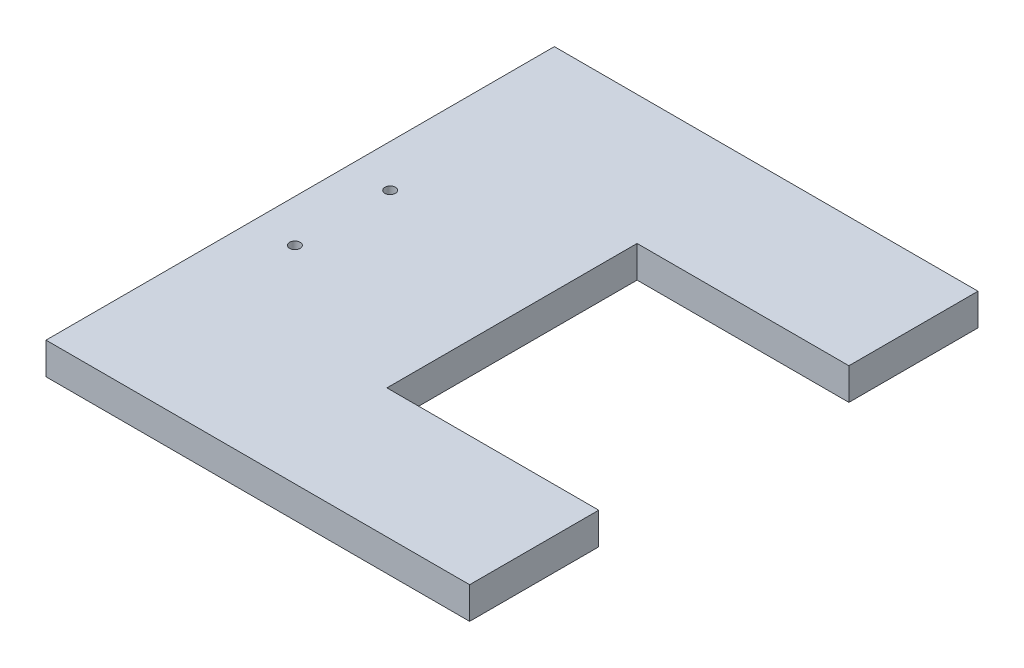
ISO-10303-21;
HEADER;
FILE_DESCRIPTION(('STEP AP214'),'2;1');
FILE_NAME('part.step','',(''),(''),'','','');
FILE_SCHEMA(('AUTOMOTIVE_DESIGN { 1 0 10303 214 1 1 1 1 }'));
ENDSEC;
DATA;
#1=APPLICATION_CONTEXT('core data for automotive mechanical design processes');
#2=APPLICATION_PROTOCOL_DEFINITION('international standard','automotive_design',2000,#1);
#3=PRODUCT_CONTEXT('',#1,'mechanical');
#4=PRODUCT('Part','Part','',(#3));
#5=PRODUCT_RELATED_PRODUCT_CATEGORY('part','',(#4));
#6=PRODUCT_DEFINITION_FORMATION('','',#4);
#7=PRODUCT_DEFINITION_CONTEXT('part definition',#1,'design');
#8=PRODUCT_DEFINITION('design','',#6,#7);
#9=PRODUCT_DEFINITION_SHAPE('','',#8);
#10=(LENGTH_UNIT() NAMED_UNIT(*) SI_UNIT(.MILLI.,.METRE.));
#11=(NAMED_UNIT(*) PLANE_ANGLE_UNIT() SI_UNIT($,.RADIAN.));
#12=(NAMED_UNIT(*) SI_UNIT($,.STERADIAN.) SOLID_ANGLE_UNIT());
#13=UNCERTAINTY_MEASURE_WITH_UNIT(LENGTH_MEASURE(1.E-05),#10,'distance_accuracy_value','');
#14=(GEOMETRIC_REPRESENTATION_CONTEXT(3) GLOBAL_UNCERTAINTY_ASSIGNED_CONTEXT((#13)) GLOBAL_UNIT_ASSIGNED_CONTEXT((#10,
#11,#12)) REPRESENTATION_CONTEXT('',''));
#15=CARTESIAN_POINT('',(0.,0.,0.));
#16=DIRECTION('',(0.,0.,1.));
#17=DIRECTION('',(1.,0.,0.));
#18=AXIS2_PLACEMENT_3D('',#15,#16,#17);
#19=CARTESIAN_POINT('',(0.,19.05,0.));
#20=DIRECTION('',(1.,0.,0.));
#21=DIRECTION('',(0.,0.,-1.));
#22=AXIS2_PLACEMENT_3D('',#19,#20,#21);
#23=PLANE('',#22);
#24=DIRECTION('',(0.,0.,1.));
#25=VECTOR('',#24,1.);
#26=CARTESIAN_POINT('',(0.,0.,0.));
#27=LINE('',#26,#25);
#28=CARTESIAN_POINT('',(0.,0.,-75.));
#29=VERTEX_POINT('',#28);
#30=CARTESIAN_POINT('',(0.,0.,75.));
#31=VERTEX_POINT('',#30);
#32=EDGE_CURVE('E156',#29,#31,#27,.T.);
#33=ORIENTED_EDGE('',*,*,#32,.F.);
#34=DIRECTION('',(0.,-1.,0.));
#35=VECTOR('',#34,1.);
#36=CARTESIAN_POINT('',(0.,19.05,-75.));
#37=LINE('',#36,#35);
#38=CARTESIAN_POINT('',(0.,19.05,-75.));
#39=VERTEX_POINT('',#38);
#40=EDGE_CURVE('E11',#39,#29,#37,.T.);
#41=ORIENTED_EDGE('',*,*,#40,.F.);
#42=DIRECTION('',(0.,0.,1.));
#43=VECTOR('',#42,1.);
#44=CARTESIAN_POINT('',(0.,19.05,0.));
#45=LINE('',#44,#43);
#46=CARTESIAN_POINT('',(0.,19.05,75.));
#47=VERTEX_POINT('',#46);
#48=EDGE_CURVE('E139',#39,#47,#45,.T.);
#49=ORIENTED_EDGE('',*,*,#48,.T.);
#50=DIRECTION('',(0.,-1.,0.));
#51=VECTOR('',#50,1.);
#52=CARTESIAN_POINT('',(0.,19.05,75.));
#53=LINE('',#52,#51);
#54=EDGE_CURVE('E87',#47,#31,#53,.T.);
#55=ORIENTED_EDGE('',*,*,#54,.T.);
#56=EDGE_LOOP('',(#33,#41,#49,#55));
#57=FACE_BOUND('',#56,.T.);
#58=ADVANCED_FACE('F37',(#57),#23,.T.);
#59=CARTESIAN_POINT('',(0.,19.05,-75.));
#60=DIRECTION('',(0.,0.,1.));
#61=DIRECTION('',(1.,0.,0.));
#62=AXIS2_PLACEMENT_3D('',#59,#60,#61);
#63=PLANE('',#62);
#64=DIRECTION('',(-1.,0.,0.));
#65=VECTOR('',#64,1.);
#66=CARTESIAN_POINT('',(0.,0.,-75.));
#67=LINE('',#66,#65);
#68=CARTESIAN_POINT('',(127.,0.,-75.));
#69=VERTEX_POINT('',#68);
#70=EDGE_CURVE('E160',#69,#29,#67,.T.);
#71=ORIENTED_EDGE('',*,*,#70,.F.);
#72=DIRECTION('',(0.,-1.,0.));
#73=VECTOR('',#72,1.);
#74=CARTESIAN_POINT('',(127.,19.05,-75.));
#75=LINE('',#74,#73);
#76=CARTESIAN_POINT('',(127.,19.05,-75.));
#77=VERTEX_POINT('',#76);
#78=EDGE_CURVE('E45',#77,#69,#75,.T.);
#79=ORIENTED_EDGE('',*,*,#78,.F.);
#80=DIRECTION('',(-1.,0.,0.));
#81=VECTOR('',#80,1.);
#82=CARTESIAN_POINT('',(0.,19.05,-75.));
#83=LINE('',#82,#81);
#84=EDGE_CURVE('E134',#77,#39,#83,.T.);
#85=ORIENTED_EDGE('',*,*,#84,.T.);
#86=ORIENTED_EDGE('',*,*,#40,.T.);
#87=EDGE_LOOP('',(#71,#79,#85,#86));
#88=FACE_BOUND('',#87,.T.);
#89=ADVANCED_FACE('F186',(#88),#63,.T.);
#90=CARTESIAN_POINT('',(127.,19.05,0.));
#91=DIRECTION('',(1.,0.,0.));
#92=DIRECTION('',(0.,0.,-1.));
#93=AXIS2_PLACEMENT_3D('',#90,#91,#92);
#94=PLANE('',#93);
#95=DIRECTION('',(0.,0.,1.));
#96=VECTOR('',#95,1.);
#97=CARTESIAN_POINT('',(127.,0.,0.));
#98=LINE('',#97,#96);
#99=CARTESIAN_POINT('',(127.,0.,-152.4));
#100=VERTEX_POINT('',#99);
#101=EDGE_CURVE('E164',#100,#69,#98,.T.);
#102=ORIENTED_EDGE('',*,*,#101,.F.);
#103=DIRECTION('',(0.,-1.,0.));
#104=VECTOR('',#103,1.);
#105=CARTESIAN_POINT('',(127.,19.05,-152.4));
#106=LINE('',#105,#104);
#107=CARTESIAN_POINT('',(127.,19.05,-152.4));
#108=VERTEX_POINT('',#107);
#109=EDGE_CURVE('E182',#108,#100,#106,.T.);
#110=ORIENTED_EDGE('',*,*,#109,.F.);
#111=DIRECTION('',(0.,0.,1.));
#112=VECTOR('',#111,1.);
#113=CARTESIAN_POINT('',(127.,19.05,0.));
#114=LINE('',#113,#112);
#115=EDGE_CURVE('E128',#108,#77,#114,.T.);
#116=ORIENTED_EDGE('',*,*,#115,.T.);
#117=ORIENTED_EDGE('',*,*,#78,.T.);
#118=EDGE_LOOP('',(#102,#110,#116,#117));
#119=FACE_BOUND('',#118,.T.);
#120=ADVANCED_FACE('F185',(#119),#94,.T.);
#121=CARTESIAN_POINT('',(0.,19.05,-152.4));
#122=DIRECTION('',(0.,0.,-1.));
#123=DIRECTION('',(-1.,0.,0.));
#124=AXIS2_PLACEMENT_3D('',#121,#122,#123);
#125=PLANE('',#124);
#126=DIRECTION('',(1.,0.,0.));
#127=VECTOR('',#126,1.);
#128=CARTESIAN_POINT('',(0.,0.,-152.4));
#129=LINE('',#128,#127);
#130=CARTESIAN_POINT('',(-127.,0.,-152.4));
#131=VERTEX_POINT('',#130);
#132=EDGE_CURVE('E169',#131,#100,#129,.T.);
#133=ORIENTED_EDGE('',*,*,#132,.F.);
#134=DIRECTION('',(0.,-1.,0.));
#135=VECTOR('',#134,1.);
#136=CARTESIAN_POINT('',(-127.,19.05,-152.4));
#137=LINE('',#136,#135);
#138=CARTESIAN_POINT('',(-127.,19.05,-152.4));
#139=VERTEX_POINT('',#138);
#140=EDGE_CURVE('E180',#139,#131,#137,.T.);
#141=ORIENTED_EDGE('',*,*,#140,.F.);
#142=DIRECTION('',(1.,0.,0.));
#143=VECTOR('',#142,1.);
#144=CARTESIAN_POINT('',(0.,19.05,-152.4));
#145=LINE('',#144,#143);
#146=EDGE_CURVE('E133',#139,#108,#145,.T.);
#147=ORIENTED_EDGE('',*,*,#146,.T.);
#148=ORIENTED_EDGE('',*,*,#109,.T.);
#149=EDGE_LOOP('',(#133,#141,#147,#148));
#150=FACE_BOUND('',#149,.T.);
#151=ADVANCED_FACE('F191',(#150),#125,.T.);
#152=CARTESIAN_POINT('',(-127.,19.05,0.));
#153=DIRECTION('',(1.,0.,0.));
#154=DIRECTION('',(0.,0.,-1.));
#155=AXIS2_PLACEMENT_3D('',#152,#153,#154);
#156=PLANE('',#155);
#157=DIRECTION('',(0.,0.,1.));
#158=VECTOR('',#157,1.);
#159=CARTESIAN_POINT('',(-127.,0.,0.));
#160=LINE('',#159,#158);
#161=CARTESIAN_POINT('',(-127.,0.,152.4));
#162=VERTEX_POINT('',#161);
#163=EDGE_CURVE('E173',#131,#162,#160,.T.);
#164=ORIENTED_EDGE('',*,*,#163,.T.);
#165=DIRECTION('',(0.,-1.,0.));
#166=VECTOR('',#165,1.);
#167=CARTESIAN_POINT('',(-127.,19.05,152.4));
#168=LINE('',#167,#166);
#169=CARTESIAN_POINT('',(-127.,19.05,152.4));
#170=VERTEX_POINT('',#169);
#171=EDGE_CURVE('E124',#170,#162,#168,.T.);
#172=ORIENTED_EDGE('',*,*,#171,.F.);
#173=DIRECTION('',(0.,0.,1.));
#174=VECTOR('',#173,1.);
#175=CARTESIAN_POINT('',(-127.,19.05,0.));
#176=LINE('',#175,#174);
#177=EDGE_CURVE('E111',#139,#170,#176,.T.);
#178=ORIENTED_EDGE('',*,*,#177,.F.);
#179=ORIENTED_EDGE('',*,*,#140,.T.);
#180=EDGE_LOOP('',(#164,#172,#178,#179));
#181=FACE_BOUND('',#180,.T.);
#182=ADVANCED_FACE('F203',(#181),#156,.F.);
#183=CARTESIAN_POINT('',(0.,19.05,152.4));
#184=DIRECTION('',(0.,0.,-1.));
#185=DIRECTION('',(-1.,0.,0.));
#186=AXIS2_PLACEMENT_3D('',#183,#184,#185);
#187=PLANE('',#186);
#188=DIRECTION('',(1.,0.,0.));
#189=VECTOR('',#188,1.);
#190=CARTESIAN_POINT('',(0.,0.,152.4));
#191=LINE('',#190,#189);
#192=CARTESIAN_POINT('',(127.,0.,152.4));
#193=VERTEX_POINT('',#192);
#194=EDGE_CURVE('E120',#162,#193,#191,.T.);
#195=ORIENTED_EDGE('',*,*,#194,.T.);
#196=DIRECTION('',(0.,-1.,0.));
#197=VECTOR('',#196,1.);
#198=CARTESIAN_POINT('',(127.,19.05,152.4));
#199=LINE('',#198,#197);
#200=CARTESIAN_POINT('',(127.,19.05,152.4));
#201=VERTEX_POINT('',#200);
#202=EDGE_CURVE('E117',#201,#193,#199,.T.);
#203=ORIENTED_EDGE('',*,*,#202,.F.);
#204=DIRECTION('',(1.,0.,0.));
#205=VECTOR('',#204,1.);
#206=CARTESIAN_POINT('',(0.,19.05,152.4));
#207=LINE('',#206,#205);
#208=EDGE_CURVE('E104',#170,#201,#207,.T.);
#209=ORIENTED_EDGE('',*,*,#208,.F.);
#210=ORIENTED_EDGE('',*,*,#171,.T.);
#211=EDGE_LOOP('',(#195,#203,#209,#210));
#212=FACE_BOUND('',#211,.T.);
#213=ADVANCED_FACE('F118',(#212),#187,.F.);
#214=CARTESIAN_POINT('',(127.,0.,75.));
#215=VERTEX_POINT('',#214);
#216=EDGE_CURVE('E170',#215,#193,#98,.T.);
#217=ORIENTED_EDGE('',*,*,#216,.F.);
#218=DIRECTION('',(0.,-1.,0.));
#219=VECTOR('',#218,1.);
#220=CARTESIAN_POINT('',(127.,19.05,75.));
#221=LINE('',#220,#219);
#222=CARTESIAN_POINT('',(127.,19.05,75.));
#223=VERTEX_POINT('',#222);
#224=EDGE_CURVE('E80',#223,#215,#221,.T.);
#225=ORIENTED_EDGE('',*,*,#224,.F.);
#226=EDGE_CURVE('E108',#223,#201,#114,.T.);
#227=ORIENTED_EDGE('',*,*,#226,.T.);
#228=ORIENTED_EDGE('',*,*,#202,.T.);
#229=EDGE_LOOP('',(#217,#225,#227,#228));
#230=FACE_BOUND('',#229,.T.);
#231=ADVANCED_FACE('F126',(#230),#94,.T.);
#232=CARTESIAN_POINT('',(0.,19.05,75.));
#233=DIRECTION('',(0.,0.,1.));
#234=DIRECTION('',(1.,0.,0.));
#235=AXIS2_PLACEMENT_3D('',#232,#233,#234);
#236=PLANE('',#235);
#237=DIRECTION('',(-1.,0.,0.));
#238=VECTOR('',#237,1.);
#239=CARTESIAN_POINT('',(0.,0.,75.));
#240=LINE('',#239,#238);
#241=EDGE_CURVE('E142',#215,#31,#240,.T.);
#242=ORIENTED_EDGE('',*,*,#241,.T.);
#243=ORIENTED_EDGE('',*,*,#54,.F.);
#244=DIRECTION('',(-1.,0.,0.));
#245=VECTOR('',#244,1.);
#246=CARTESIAN_POINT('',(0.,19.05,75.));
#247=LINE('',#246,#245);
#248=EDGE_CURVE('E53',#223,#47,#247,.T.);
#249=ORIENTED_EDGE('',*,*,#248,.F.);
#250=ORIENTED_EDGE('',*,*,#224,.T.);
#251=EDGE_LOOP('',(#242,#243,#249,#250));
#252=FACE_BOUND('',#251,.T.);
#253=ADVANCED_FACE('F210',(#252),#236,.F.);
#254=CARTESIAN_POINT('',(0.,19.05,0.));
#255=DIRECTION('',(0.,1.,0.));
#256=DIRECTION('',(0.,0.,1.));
#257=AXIS2_PLACEMENT_3D('',#254,#255,#256);
#258=PLANE('',#257);
#259=CARTESIAN_POINT('',(-101.6,19.05,-28.575));
#260=DIRECTION('',(0.,1.,0.));
#261=DIRECTION('',(0.,0.,1.));
#262=AXIS2_PLACEMENT_3D('',#259,#260,#261);
#263=CIRCLE('',#262,3.175);
#264=CARTESIAN_POINT('',(-101.6,19.05,-25.4));
#265=VERTEX_POINT('',#264);
#266=EDGE_CURVE('E151',#265,#265,#263,.T.);
#267=ORIENTED_EDGE('',*,*,#266,.F.);
#268=EDGE_LOOP('',(#267));
#269=FACE_BOUND('',#268,.T.);
#270=CARTESIAN_POINT('',(-101.6,19.05,28.575));
#271=DIRECTION('',(0.,1.,0.));
#272=DIRECTION('',(0.,0.,1.));
#273=AXIS2_PLACEMENT_3D('',#270,#271,#272);
#274=CIRCLE('',#273,3.175);
#275=CARTESIAN_POINT('',(-101.6,19.05,31.75));
#276=VERTEX_POINT('',#275);
#277=EDGE_CURVE('E145',#276,#276,#274,.T.);
#278=ORIENTED_EDGE('',*,*,#277,.F.);
#279=EDGE_LOOP('',(#278));
#280=FACE_BOUND('',#279,.T.);
#281=ORIENTED_EDGE('',*,*,#48,.F.);
#282=ORIENTED_EDGE('',*,*,#84,.F.);
#283=ORIENTED_EDGE('',*,*,#115,.F.);
#284=ORIENTED_EDGE('',*,*,#146,.F.);
#285=ORIENTED_EDGE('',*,*,#177,.T.);
#286=ORIENTED_EDGE('',*,*,#208,.T.);
#287=ORIENTED_EDGE('',*,*,#226,.F.);
#288=ORIENTED_EDGE('',*,*,#248,.T.);
#289=EDGE_LOOP('',(#281,#282,#283,#284,#285,#286,#287,#288));
#290=FACE_BOUND('',#289,.T.);
#291=ADVANCED_FACE('F106',(#269,#280,#290),#258,.T.);
#292=CARTESIAN_POINT('',(0.,0.,0.));
#293=DIRECTION('',(0.,1.,0.));
#294=DIRECTION('',(0.,0.,1.));
#295=AXIS2_PLACEMENT_3D('',#292,#293,#294);
#296=PLANE('',#295);
#297=CARTESIAN_POINT('',(-101.6,0.,-28.575));
#298=DIRECTION('',(0.,1.,0.));
#299=DIRECTION('',(0.,0.,1.));
#300=AXIS2_PLACEMENT_3D('',#297,#298,#299);
#301=CIRCLE('',#300,3.175);
#302=CARTESIAN_POINT('',(-101.6,0.,-25.4));
#303=VERTEX_POINT('',#302);
#304=EDGE_CURVE('E154',#303,#303,#301,.T.);
#305=ORIENTED_EDGE('',*,*,#304,.T.);
#306=EDGE_LOOP('',(#305));
#307=FACE_BOUND('',#306,.T.);
#308=CARTESIAN_POINT('',(-101.6,0.,28.575));
#309=DIRECTION('',(0.,1.,0.));
#310=DIRECTION('',(0.,0.,1.));
#311=AXIS2_PLACEMENT_3D('',#308,#309,#310);
#312=CIRCLE('',#311,3.175);
#313=CARTESIAN_POINT('',(-101.6,0.,31.75));
#314=VERTEX_POINT('',#313);
#315=EDGE_CURVE('E148',#314,#314,#312,.T.);
#316=ORIENTED_EDGE('',*,*,#315,.T.);
#317=EDGE_LOOP('',(#316));
#318=FACE_BOUND('',#317,.T.);
#319=ORIENTED_EDGE('',*,*,#32,.T.);
#320=ORIENTED_EDGE('',*,*,#241,.F.);
#321=ORIENTED_EDGE('',*,*,#216,.T.);
#322=ORIENTED_EDGE('',*,*,#194,.F.);
#323=ORIENTED_EDGE('',*,*,#163,.F.);
#324=ORIENTED_EDGE('',*,*,#132,.T.);
#325=ORIENTED_EDGE('',*,*,#101,.T.);
#326=ORIENTED_EDGE('',*,*,#70,.T.);
#327=EDGE_LOOP('',(#319,#320,#321,#322,#323,#324,#325,#326));
#328=FACE_BOUND('',#327,.T.);
#329=ADVANCED_FACE('F187',(#307,#318,#328),#296,.F.);
#330=CARTESIAN_POINT('',(-101.6,0.,28.575));
#331=DIRECTION('',(0.,1.,0.));
#332=DIRECTION('',(0.,0.,1.));
#333=AXIS2_PLACEMENT_3D('',#330,#331,#332);
#334=CYLINDRICAL_SURFACE('',#333,3.175);
#335=CARTESIAN_POINT('',(-101.6,0.,31.75));
#336=CARTESIAN_POINT('',(-101.6,0.1984375,31.75));
#337=CARTESIAN_POINT('',(-101.6,0.396875,31.75));
#338=CARTESIAN_POINT('',(-101.6,0.79375,31.75));
#339=CARTESIAN_POINT('',(-101.6,0.9921875,31.75));
#340=CARTESIAN_POINT('',(-101.6,1.3890625,31.75));
#341=CARTESIAN_POINT('',(-101.6,1.5875,31.75));
#342=CARTESIAN_POINT('',(-101.6,1.984375,31.75));
#343=CARTESIAN_POINT('',(-101.6,2.1828125,31.75));
#344=CARTESIAN_POINT('',(-101.6,2.5796875,31.75));
#345=CARTESIAN_POINT('',(-101.6,2.778125,31.75));
#346=CARTESIAN_POINT('',(-101.6,3.175,31.75));
#347=CARTESIAN_POINT('',(-101.6,3.3734375,31.75));
#348=CARTESIAN_POINT('',(-101.6,3.7703125,31.75));
#349=CARTESIAN_POINT('',(-101.6,3.96875,31.75));
#350=CARTESIAN_POINT('',(-101.6,4.365625,31.75));
#351=CARTESIAN_POINT('',(-101.6,4.5640625,31.75));
#352=CARTESIAN_POINT('',(-101.6,4.9609375,31.75));
#353=CARTESIAN_POINT('',(-101.6,5.159375,31.75));
#354=CARTESIAN_POINT('',(-101.6,5.55625,31.75));
#355=CARTESIAN_POINT('',(-101.6,5.7546875,31.75));
#356=CARTESIAN_POINT('',(-101.6,6.1515625,31.75));
#357=CARTESIAN_POINT('',(-101.6,6.35,31.75));
#358=CARTESIAN_POINT('',(-101.6,6.746875,31.75));
#359=CARTESIAN_POINT('',(-101.6,6.9453125,31.75));
#360=CARTESIAN_POINT('',(-101.6,7.3421875,31.75));
#361=CARTESIAN_POINT('',(-101.6,7.540625,31.75));
#362=CARTESIAN_POINT('',(-101.6,7.9375,31.75));
#363=CARTESIAN_POINT('',(-101.6,8.1359375,31.75));
#364=CARTESIAN_POINT('',(-101.6,8.5328125,31.75));
#365=CARTESIAN_POINT('',(-101.6,8.73125,31.75));
#366=CARTESIAN_POINT('',(-101.6,9.128125,31.75));
#367=CARTESIAN_POINT('',(-101.6,9.3265625,31.75));
#368=CARTESIAN_POINT('',(-101.6,9.7234375,31.75));
#369=CARTESIAN_POINT('',(-101.6,9.921875,31.75));
#370=CARTESIAN_POINT('',(-101.6,10.31875,31.75));
#371=CARTESIAN_POINT('',(-101.6,10.5171875,31.75));
#372=CARTESIAN_POINT('',(-101.6,10.9140625,31.75));
#373=CARTESIAN_POINT('',(-101.6,11.1125,31.75));
#374=CARTESIAN_POINT('',(-101.6,11.509375,31.75));
#375=CARTESIAN_POINT('',(-101.6,11.7078125,31.75));
#376=CARTESIAN_POINT('',(-101.6,12.1046875,31.75));
#377=CARTESIAN_POINT('',(-101.6,12.303125,31.75));
#378=CARTESIAN_POINT('',(-101.6,12.7,31.75));
#379=CARTESIAN_POINT('',(-101.6,12.8984375,31.75));
#380=CARTESIAN_POINT('',(-101.6,13.2953125,31.75));
#381=CARTESIAN_POINT('',(-101.6,13.49375,31.75));
#382=CARTESIAN_POINT('',(-101.6,13.890625,31.75));
#383=CARTESIAN_POINT('',(-101.6,14.0890625,31.75));
#384=CARTESIAN_POINT('',(-101.6,14.4859375,31.75));
#385=CARTESIAN_POINT('',(-101.6,14.684375,31.75));
#386=CARTESIAN_POINT('',(-101.6,15.08125,31.75));
#387=CARTESIAN_POINT('',(-101.6,15.2796875,31.75));
#388=CARTESIAN_POINT('',(-101.6,15.6765625,31.75));
#389=CARTESIAN_POINT('',(-101.6,15.875,31.75));
#390=CARTESIAN_POINT('',(-101.6,16.271875,31.75));
#391=CARTESIAN_POINT('',(-101.6,16.4703125,31.75));
#392=CARTESIAN_POINT('',(-101.6,16.8671875,31.75));
#393=CARTESIAN_POINT('',(-101.6,17.065625,31.75));
#394=CARTESIAN_POINT('',(-101.6,17.4625,31.75));
#395=CARTESIAN_POINT('',(-101.6,17.6609375,31.75));
#396=CARTESIAN_POINT('',(-101.6,18.0578125,31.75));
#397=CARTESIAN_POINT('',(-101.6,18.25625,31.75));
#398=CARTESIAN_POINT('',(-101.6,18.653125,31.75));
#399=CARTESIAN_POINT('',(-101.6,18.8515625,31.75));
#400=CARTESIAN_POINT('',(-101.6,19.05,31.75));
#401=B_SPLINE_CURVE_WITH_KNOTS('',3,(#335,#336,#337,#338,#339,#340,#341,#342,#343,#344,#345,
#346,#347,#348,#349,#350,#351,#352,#353,#354,#355,#356,#357,#358,#359,#360,#361,#362,#363,#364,
#365,#366,#367,#368,#369,#370,#371,#372,#373,#374,#375,#376,#377,#378,#379,#380,#381,#382,#383,
#384,#385,#386,#387,#388,#389,#390,#391,#392,#393,#394,#395,#396,#397,#398,#399,#400),
.UNSPECIFIED.,.F.,.F.,(4,2,2,2,2,2,2,2,2,2,2,2,2,2,2,2,2,2,2,2,2,2,2,2,2,2,2,2,2,2,2,2,4),(0.,
0.5953125,1.190625,1.7859375,2.38125,2.9765625,3.571875,4.1671875,4.7625,5.3578125,5.953125,
6.5484375,7.14375,7.7390625,8.334375,8.9296875,9.525,10.1203125,10.715625,11.3109375,11.90625,
12.5015625,13.096875,13.6921875,14.2875,14.8828125,15.478125,16.0734375,16.66875,17.2640625,
17.859375,18.4546875,19.05),.UNSPECIFIED.);
#402=EDGE_CURVE('BSEAM215',#314,#276,#401,.T.);
#403=ORIENTED_EDGE('',*,*,#315,.F.);
#404=ORIENTED_EDGE('',*,*,#277,.T.);
#405=ORIENTED_EDGE('',*,*,#402,.T.);
#406=ORIENTED_EDGE('',*,*,#402,.F.);
#407=EDGE_LOOP('',(#403,#405,#404,#406));
#408=FACE_BOUND('',#407,.T.);
#409=ADVANCED_FACE('F215',(#408),#334,.F.);
#410=CARTESIAN_POINT('',(-101.6,0.,-28.575));
#411=DIRECTION('',(0.,1.,0.));
#412=DIRECTION('',(0.,0.,1.));
#413=AXIS2_PLACEMENT_3D('',#410,#411,#412);
#414=CYLINDRICAL_SURFACE('',#413,3.175);
#415=CARTESIAN_POINT('',(-101.6,0.,-25.4));
#416=CARTESIAN_POINT('',(-101.6,0.1984375,-25.4));
#417=CARTESIAN_POINT('',(-101.6,0.396875,-25.4));
#418=CARTESIAN_POINT('',(-101.6,0.79375,-25.4));
#419=CARTESIAN_POINT('',(-101.6,0.9921875,-25.4));
#420=CARTESIAN_POINT('',(-101.6,1.3890625,-25.4));
#421=CARTESIAN_POINT('',(-101.6,1.5875,-25.4));
#422=CARTESIAN_POINT('',(-101.6,1.984375,-25.4));
#423=CARTESIAN_POINT('',(-101.6,2.1828125,-25.4));
#424=CARTESIAN_POINT('',(-101.6,2.5796875,-25.4));
#425=CARTESIAN_POINT('',(-101.6,2.778125,-25.4));
#426=CARTESIAN_POINT('',(-101.6,3.175,-25.4));
#427=CARTESIAN_POINT('',(-101.6,3.3734375,-25.4));
#428=CARTESIAN_POINT('',(-101.6,3.7703125,-25.4));
#429=CARTESIAN_POINT('',(-101.6,3.96875,-25.4));
#430=CARTESIAN_POINT('',(-101.6,4.365625,-25.4));
#431=CARTESIAN_POINT('',(-101.6,4.5640625,-25.4));
#432=CARTESIAN_POINT('',(-101.6,4.9609375,-25.4));
#433=CARTESIAN_POINT('',(-101.6,5.159375,-25.4));
#434=CARTESIAN_POINT('',(-101.6,5.55625,-25.4));
#435=CARTESIAN_POINT('',(-101.6,5.7546875,-25.4));
#436=CARTESIAN_POINT('',(-101.6,6.1515625,-25.4));
#437=CARTESIAN_POINT('',(-101.6,6.35,-25.4));
#438=CARTESIAN_POINT('',(-101.6,6.746875,-25.4));
#439=CARTESIAN_POINT('',(-101.6,6.9453125,-25.4));
#440=CARTESIAN_POINT('',(-101.6,7.3421875,-25.4));
#441=CARTESIAN_POINT('',(-101.6,7.540625,-25.4));
#442=CARTESIAN_POINT('',(-101.6,7.9375,-25.4));
#443=CARTESIAN_POINT('',(-101.6,8.1359375,-25.4));
#444=CARTESIAN_POINT('',(-101.6,8.5328125,-25.4));
#445=CARTESIAN_POINT('',(-101.6,8.73125,-25.4));
#446=CARTESIAN_POINT('',(-101.6,9.128125,-25.4));
#447=CARTESIAN_POINT('',(-101.6,9.3265625,-25.4));
#448=CARTESIAN_POINT('',(-101.6,9.7234375,-25.4));
#449=CARTESIAN_POINT('',(-101.6,9.921875,-25.4));
#450=CARTESIAN_POINT('',(-101.6,10.31875,-25.4));
#451=CARTESIAN_POINT('',(-101.6,10.5171875,-25.4));
#452=CARTESIAN_POINT('',(-101.6,10.9140625,-25.4));
#453=CARTESIAN_POINT('',(-101.6,11.1125,-25.4));
#454=CARTESIAN_POINT('',(-101.6,11.509375,-25.4));
#455=CARTESIAN_POINT('',(-101.6,11.7078125,-25.4));
#456=CARTESIAN_POINT('',(-101.6,12.1046875,-25.4));
#457=CARTESIAN_POINT('',(-101.6,12.303125,-25.4));
#458=CARTESIAN_POINT('',(-101.6,12.7,-25.4));
#459=CARTESIAN_POINT('',(-101.6,12.8984375,-25.4));
#460=CARTESIAN_POINT('',(-101.6,13.2953125,-25.4));
#461=CARTESIAN_POINT('',(-101.6,13.49375,-25.4));
#462=CARTESIAN_POINT('',(-101.6,13.890625,-25.4));
#463=CARTESIAN_POINT('',(-101.6,14.0890625,-25.4));
#464=CARTESIAN_POINT('',(-101.6,14.4859375,-25.4));
#465=CARTESIAN_POINT('',(-101.6,14.684375,-25.4));
#466=CARTESIAN_POINT('',(-101.6,15.08125,-25.4));
#467=CARTESIAN_POINT('',(-101.6,15.2796875,-25.4));
#468=CARTESIAN_POINT('',(-101.6,15.6765625,-25.4));
#469=CARTESIAN_POINT('',(-101.6,15.875,-25.4));
#470=CARTESIAN_POINT('',(-101.6,16.271875,-25.4));
#471=CARTESIAN_POINT('',(-101.6,16.4703125,-25.4));
#472=CARTESIAN_POINT('',(-101.6,16.8671875,-25.4));
#473=CARTESIAN_POINT('',(-101.6,17.065625,-25.4));
#474=CARTESIAN_POINT('',(-101.6,17.4625,-25.4));
#475=CARTESIAN_POINT('',(-101.6,17.6609375,-25.4));
#476=CARTESIAN_POINT('',(-101.6,18.0578125,-25.4));
#477=CARTESIAN_POINT('',(-101.6,18.25625,-25.4));
#478=CARTESIAN_POINT('',(-101.6,18.653125,-25.4));
#479=CARTESIAN_POINT('',(-101.6,18.8515625,-25.4));
#480=CARTESIAN_POINT('',(-101.6,19.05,-25.4));
#481=B_SPLINE_CURVE_WITH_KNOTS('',3,(#415,#416,#417,#418,#419,#420,#421,#422,#423,#424,#425,
#426,#427,#428,#429,#430,#431,#432,#433,#434,#435,#436,#437,#438,#439,#440,#441,#442,#443,#444,
#445,#446,#447,#448,#449,#450,#451,#452,#453,#454,#455,#456,#457,#458,#459,#460,#461,#462,#463,
#464,#465,#466,#467,#468,#469,#470,#471,#472,#473,#474,#475,#476,#477,#478,#479,#480),
.UNSPECIFIED.,.F.,.F.,(4,2,2,2,2,2,2,2,2,2,2,2,2,2,2,2,2,2,2,2,2,2,2,2,2,2,2,2,2,2,2,2,4),(0.,
0.5953125,1.190625,1.7859375,2.38125,2.9765625,3.571875,4.1671875,4.7625,5.3578125,5.953125,
6.5484375,7.14375,7.7390625,8.334375,8.9296875,9.525,10.1203125,10.715625,11.3109375,11.90625,
12.5015625,13.096875,13.6921875,14.2875,14.8828125,15.478125,16.0734375,16.66875,17.2640625,
17.859375,18.4546875,19.05),.UNSPECIFIED.);
#482=EDGE_CURVE('BSEAM221',#303,#265,#481,.T.);
#483=ORIENTED_EDGE('',*,*,#304,.F.);
#484=ORIENTED_EDGE('',*,*,#266,.T.);
#485=ORIENTED_EDGE('',*,*,#482,.T.);
#486=ORIENTED_EDGE('',*,*,#482,.F.);
#487=EDGE_LOOP('',(#483,#485,#484,#486));
#488=FACE_BOUND('',#487,.T.);
#489=ADVANCED_FACE('F221',(#488),#414,.F.);
#490=CLOSED_SHELL('',(#58,#89,#120,#151,#182,#213,#231,#253,#291,#329,#409,#489));
#491=MANIFOLD_SOLID_BREP('B2',#490);
#492=ADVANCED_BREP_SHAPE_REPRESENTATION('',(#18,#491),#14);
#493=SHAPE_DEFINITION_REPRESENTATION(#9,#492);
ENDSEC;
END-ISO-10303-21;
